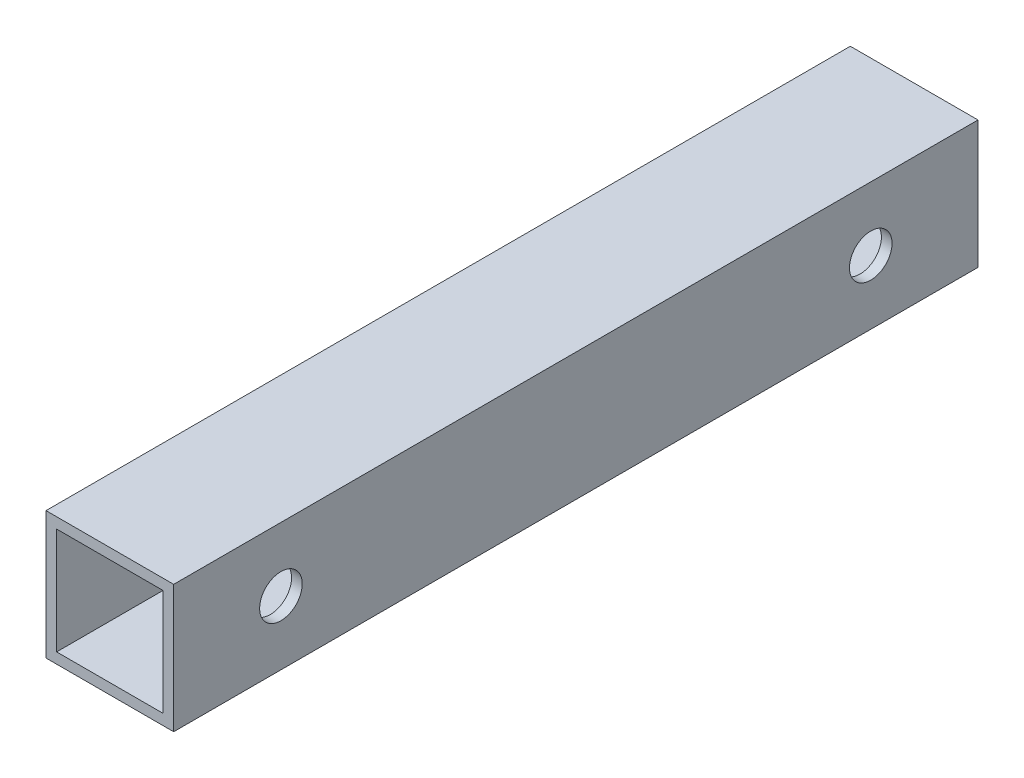
ISO-10303-21;
HEADER;
FILE_DESCRIPTION(('STEP AP214'),'2;1');
FILE_NAME('part.step','',(''),(''),'','','');
FILE_SCHEMA(('AUTOMOTIVE_DESIGN { 1 0 10303 214 1 1 1 1 }'));
ENDSEC;
DATA;
#1=APPLICATION_CONTEXT('core data for automotive mechanical design processes');
#2=APPLICATION_PROTOCOL_DEFINITION('international standard','automotive_design',2000,#1);
#3=PRODUCT_CONTEXT('',#1,'mechanical');
#4=PRODUCT('Part','Part','',(#3));
#5=PRODUCT_RELATED_PRODUCT_CATEGORY('part','',(#4));
#6=PRODUCT_DEFINITION_FORMATION('','',#4);
#7=PRODUCT_DEFINITION_CONTEXT('part definition',#1,'design');
#8=PRODUCT_DEFINITION('design','',#6,#7);
#9=PRODUCT_DEFINITION_SHAPE('','',#8);
#10=(LENGTH_UNIT() NAMED_UNIT(*) SI_UNIT(.MILLI.,.METRE.));
#11=(NAMED_UNIT(*) PLANE_ANGLE_UNIT() SI_UNIT($,.RADIAN.));
#12=(NAMED_UNIT(*) SI_UNIT($,.STERADIAN.) SOLID_ANGLE_UNIT());
#13=UNCERTAINTY_MEASURE_WITH_UNIT(LENGTH_MEASURE(1.E-05),#10,'distance_accuracy_value','');
#14=(GEOMETRIC_REPRESENTATION_CONTEXT(3) GLOBAL_UNCERTAINTY_ASSIGNED_CONTEXT((#13)) GLOBAL_UNIT_ASSIGNED_CONTEXT((#10,
#11,#12)) REPRESENTATION_CONTEXT('',''));
#15=CARTESIAN_POINT('',(0.,0.,0.));
#16=DIRECTION('',(0.,0.,1.));
#17=DIRECTION('',(1.,0.,0.));
#18=AXIS2_PLACEMENT_3D('',#15,#16,#17);
#19=CARTESIAN_POINT('',(0.,0.,15.));
#20=DIRECTION('',(0.,0.,-1.));
#21=DIRECTION('',(-1.,0.,0.));
#22=AXIS2_PLACEMENT_3D('',#19,#20,#21);
#23=PLANE('',#22);
#24=DIRECTION('',(0.,1.,0.));
#25=VECTOR('',#24,1.);
#26=CARTESIAN_POINT('',(2.38125,-2.38125000000001,15.));
#27=LINE('',#26,#25);
#28=CARTESIAN_POINT('',(2.38125,-2.38125000000001,15.));
#29=VERTEX_POINT('',#28);
#30=CARTESIAN_POINT('',(2.38125,2.38124999999999,15.));
#31=VERTEX_POINT('',#30);
#32=EDGE_CURVE('E137',#29,#31,#27,.T.);
#33=ORIENTED_EDGE('',*,*,#32,.T.);
#34=DIRECTION('',(-1.,0.,0.));
#35=VECTOR('',#34,1.);
#36=CARTESIAN_POINT('',(-2.38125,2.38124999999999,15.));
#37=LINE('',#36,#35);
#38=CARTESIAN_POINT('',(-2.38125,2.38124999999999,15.));
#39=VERTEX_POINT('',#38);
#40=EDGE_CURVE('E140',#31,#39,#37,.T.);
#41=ORIENTED_EDGE('',*,*,#40,.T.);
#42=DIRECTION('',(0.,-1.,0.));
#43=VECTOR('',#42,1.);
#44=CARTESIAN_POINT('',(-2.38125,-2.38125000000001,15.));
#45=LINE('',#44,#43);
#46=CARTESIAN_POINT('',(-2.38125,-2.38125000000001,15.));
#47=VERTEX_POINT('',#46);
#48=EDGE_CURVE('E143',#39,#47,#45,.T.);
#49=ORIENTED_EDGE('',*,*,#48,.T.);
#50=DIRECTION('',(1.,0.,0.));
#51=VECTOR('',#50,1.);
#52=CARTESIAN_POINT('',(-2.38125,-2.38125000000001,15.));
#53=LINE('',#52,#51);
#54=EDGE_CURVE('E145',#47,#29,#53,.T.);
#55=ORIENTED_EDGE('',*,*,#54,.T.);
#56=EDGE_LOOP('',(#33,#41,#49,#55));
#57=FACE_BOUND('',#56,.T.);
#58=DIRECTION('',(0.,1.,0.));
#59=VECTOR('',#58,1.);
#60=CARTESIAN_POINT('',(1.984375,-1.98437500000001,15.));
#61=LINE('',#60,#59);
#62=CARTESIAN_POINT('',(1.984375,-1.98437500000001,15.));
#63=VERTEX_POINT('',#62);
#64=CARTESIAN_POINT('',(1.984375,1.98437499999999,15.));
#65=VERTEX_POINT('',#64);
#66=EDGE_CURVE('E99',#63,#65,#61,.T.);
#67=ORIENTED_EDGE('',*,*,#66,.F.);
#68=DIRECTION('',(1.,0.,0.));
#69=VECTOR('',#68,1.);
#70=CARTESIAN_POINT('',(-1.984375,-1.98437500000001,15.));
#71=LINE('',#70,#69);
#72=CARTESIAN_POINT('',(-1.984375,-1.98437500000001,15.));
#73=VERTEX_POINT('',#72);
#74=EDGE_CURVE('E121',#73,#63,#71,.T.);
#75=ORIENTED_EDGE('',*,*,#74,.F.);
#76=DIRECTION('',(0.,-1.,0.));
#77=VECTOR('',#76,1.);
#78=CARTESIAN_POINT('',(-1.984375,-1.98437500000001,15.));
#79=LINE('',#78,#77);
#80=CARTESIAN_POINT('',(-1.984375,1.98437499999999,15.));
#81=VERTEX_POINT('',#80);
#82=EDGE_CURVE('E119',#81,#73,#79,.T.);
#83=ORIENTED_EDGE('',*,*,#82,.F.);
#84=DIRECTION('',(-1.,0.,0.));
#85=VECTOR('',#84,1.);
#86=CARTESIAN_POINT('',(-1.984375,1.98437499999999,15.));
#87=LINE('',#86,#85);
#88=EDGE_CURVE('E107',#65,#81,#87,.T.);
#89=ORIENTED_EDGE('',*,*,#88,.F.);
#90=EDGE_LOOP('',(#67,#75,#83,#89));
#91=FACE_BOUND('',#90,.T.);
#92=ADVANCED_FACE('F32',(#57,#91),#23,.F.);
#93=CARTESIAN_POINT('',(0.,0.,-15.));
#94=DIRECTION('',(0.,0.,-1.));
#95=DIRECTION('',(-1.,0.,0.));
#96=AXIS2_PLACEMENT_3D('',#93,#94,#95);
#97=PLANE('',#96);
#98=DIRECTION('',(0.,1.,0.));
#99=VECTOR('',#98,1.);
#100=CARTESIAN_POINT('',(2.38125,-2.38125000000001,-15.));
#101=LINE('',#100,#99);
#102=CARTESIAN_POINT('',(2.38125,-2.38125000000001,-15.));
#103=VERTEX_POINT('',#102);
#104=CARTESIAN_POINT('',(2.38125,2.38124999999999,-15.));
#105=VERTEX_POINT('',#104);
#106=EDGE_CURVE('E115',#103,#105,#101,.T.);
#107=ORIENTED_EDGE('',*,*,#106,.F.);
#108=DIRECTION('',(1.,0.,0.));
#109=VECTOR('',#108,1.);
#110=CARTESIAN_POINT('',(-2.38125,-2.38125000000001,-15.));
#111=LINE('',#110,#109);
#112=CARTESIAN_POINT('',(-2.38125,-2.38125000000001,-15.));
#113=VERTEX_POINT('',#112);
#114=EDGE_CURVE('E141',#113,#103,#111,.T.);
#115=ORIENTED_EDGE('',*,*,#114,.F.);
#116=DIRECTION('',(0.,-1.,0.));
#117=VECTOR('',#116,1.);
#118=CARTESIAN_POINT('',(-2.38125,-2.38125000000001,-15.));
#119=LINE('',#118,#117);
#120=CARTESIAN_POINT('',(-2.38125,2.38124999999999,-15.));
#121=VERTEX_POINT('',#120);
#122=EDGE_CURVE('E152',#121,#113,#119,.T.);
#123=ORIENTED_EDGE('',*,*,#122,.F.);
#124=DIRECTION('',(-1.,0.,0.));
#125=VECTOR('',#124,1.);
#126=CARTESIAN_POINT('',(-2.38125,2.38124999999999,-15.));
#127=LINE('',#126,#125);
#128=EDGE_CURVE('E150',#105,#121,#127,.T.);
#129=ORIENTED_EDGE('',*,*,#128,.F.);
#130=EDGE_LOOP('',(#107,#115,#123,#129));
#131=FACE_BOUND('',#130,.T.);
#132=DIRECTION('',(1.,0.,0.));
#133=VECTOR('',#132,1.);
#134=CARTESIAN_POINT('',(-1.984375,-1.98437500000001,-15.));
#135=LINE('',#134,#133);
#136=CARTESIAN_POINT('',(-1.984375,-1.98437500000001,-15.));
#137=VERTEX_POINT('',#136);
#138=CARTESIAN_POINT('',(1.984375,-1.98437500000001,-15.));
#139=VERTEX_POINT('',#138);
#140=EDGE_CURVE('E108',#137,#139,#135,.T.);
#141=ORIENTED_EDGE('',*,*,#140,.T.);
#142=DIRECTION('',(0.,1.,0.));
#143=VECTOR('',#142,1.);
#144=CARTESIAN_POINT('',(1.984375,-1.98437500000001,-15.));
#145=LINE('',#144,#143);
#146=CARTESIAN_POINT('',(1.984375,1.98437499999999,-15.));
#147=VERTEX_POINT('',#146);
#148=EDGE_CURVE('E57',#139,#147,#145,.T.);
#149=ORIENTED_EDGE('',*,*,#148,.T.);
#150=DIRECTION('',(-1.,0.,0.));
#151=VECTOR('',#150,1.);
#152=CARTESIAN_POINT('',(-1.984375,1.98437499999999,-15.));
#153=LINE('',#152,#151);
#154=CARTESIAN_POINT('',(-1.984375,1.98437499999999,-15.));
#155=VERTEX_POINT('',#154);
#156=EDGE_CURVE('E114',#147,#155,#153,.T.);
#157=ORIENTED_EDGE('',*,*,#156,.T.);
#158=DIRECTION('',(0.,-1.,0.));
#159=VECTOR('',#158,1.);
#160=CARTESIAN_POINT('',(-1.984375,-1.98437500000001,-15.));
#161=LINE('',#160,#159);
#162=EDGE_CURVE('E129',#155,#137,#161,.T.);
#163=ORIENTED_EDGE('',*,*,#162,.T.);
#164=EDGE_LOOP('',(#141,#149,#157,#163));
#165=FACE_BOUND('',#164,.T.);
#166=ADVANCED_FACE('F199',(#131,#165),#97,.T.);
#167=CARTESIAN_POINT('',(2.38125,-2.38125000000001,15.));
#168=DIRECTION('',(-1.,0.,0.));
#169=DIRECTION('',(0.,0.,1.));
#170=AXIS2_PLACEMENT_3D('',#167,#168,#169);
#171=PLANE('',#170);
#172=CARTESIAN_POINT('',(2.38125,0.,11.));
#173=DIRECTION('',(-1.,0.,0.));
#174=DIRECTION('',(0.,0.,1.));
#175=AXIS2_PLACEMENT_3D('',#172,#173,#174);
#176=CIRCLE('',#175,0.793749999999999);
#177=CARTESIAN_POINT('',(2.38125,0.,11.79375));
#178=VERTEX_POINT('',#177);
#179=EDGE_CURVE('E181',#178,#178,#176,.T.);
#180=ORIENTED_EDGE('',*,*,#179,.T.);
#181=EDGE_LOOP('',(#180));
#182=FACE_BOUND('',#181,.T.);
#183=CARTESIAN_POINT('',(2.38125,0.,-11.));
#184=DIRECTION('',(-1.,0.,0.));
#185=DIRECTION('',(0.,0.,1.));
#186=AXIS2_PLACEMENT_3D('',#183,#184,#185);
#187=CIRCLE('',#186,0.793749999999999);
#188=CARTESIAN_POINT('',(2.38125,0.,-10.20625));
#189=VERTEX_POINT('',#188);
#190=EDGE_CURVE('E163',#189,#189,#187,.T.);
#191=ORIENTED_EDGE('',*,*,#190,.T.);
#192=EDGE_LOOP('',(#191));
#193=FACE_BOUND('',#192,.T.);
#194=ORIENTED_EDGE('',*,*,#106,.T.);
#195=DIRECTION('',(0.,0.,-1.));
#196=VECTOR('',#195,1.);
#197=CARTESIAN_POINT('',(2.38125,2.38124999999999,15.));
#198=LINE('',#197,#196);
#199=EDGE_CURVE('E11',#31,#105,#198,.T.);
#200=ORIENTED_EDGE('',*,*,#199,.F.);
#201=ORIENTED_EDGE('',*,*,#32,.F.);
#202=DIRECTION('',(0.,0.,-1.));
#203=VECTOR('',#202,1.);
#204=CARTESIAN_POINT('',(2.38125,-2.38125000000001,15.));
#205=LINE('',#204,#203);
#206=EDGE_CURVE('E147',#29,#103,#205,.T.);
#207=ORIENTED_EDGE('',*,*,#206,.T.);
#208=EDGE_LOOP('',(#194,#200,#201,#207));
#209=FACE_BOUND('',#208,.T.);
#210=ADVANCED_FACE('F34',(#182,#193,#209),#171,.F.);
#211=CARTESIAN_POINT('',(-2.38125,2.38124999999999,15.));
#212=DIRECTION('',(0.,-1.,0.));
#213=DIRECTION('',(0.,0.,-1.));
#214=AXIS2_PLACEMENT_3D('',#211,#212,#213);
#215=PLANE('',#214);
#216=ORIENTED_EDGE('',*,*,#128,.T.);
#217=DIRECTION('',(0.,0.,-1.));
#218=VECTOR('',#217,1.);
#219=CARTESIAN_POINT('',(-2.38125,2.38124999999999,15.));
#220=LINE('',#219,#218);
#221=EDGE_CURVE('E41',#39,#121,#220,.T.);
#222=ORIENTED_EDGE('',*,*,#221,.F.);
#223=ORIENTED_EDGE('',*,*,#40,.F.);
#224=ORIENTED_EDGE('',*,*,#199,.T.);
#225=EDGE_LOOP('',(#216,#222,#223,#224));
#226=FACE_BOUND('',#225,.T.);
#227=ADVANCED_FACE('F225',(#226),#215,.F.);
#228=CARTESIAN_POINT('',(-2.38125,-2.38125000000001,15.));
#229=DIRECTION('',(1.,0.,0.));
#230=DIRECTION('',(0.,0.,-1.));
#231=AXIS2_PLACEMENT_3D('',#228,#229,#230);
#232=PLANE('',#231);
#233=CARTESIAN_POINT('',(-2.38125,0.,11.));
#234=DIRECTION('',(-1.,0.,0.));
#235=DIRECTION('',(0.,0.,1.));
#236=AXIS2_PLACEMENT_3D('',#233,#234,#235);
#237=CIRCLE('',#236,0.793749999999999);
#238=CARTESIAN_POINT('',(-2.38125,0.,11.79375));
#239=VERTEX_POINT('',#238);
#240=EDGE_CURVE('E178',#239,#239,#237,.T.);
#241=ORIENTED_EDGE('',*,*,#240,.F.);
#242=EDGE_LOOP('',(#241));
#243=FACE_BOUND('',#242,.T.);
#244=CARTESIAN_POINT('',(-2.38125,0.,-11.));
#245=DIRECTION('',(-1.,0.,0.));
#246=DIRECTION('',(0.,0.,1.));
#247=AXIS2_PLACEMENT_3D('',#244,#245,#246);
#248=CIRCLE('',#247,0.793749999999999);
#249=CARTESIAN_POINT('',(-2.38125,0.,-10.20625));
#250=VERTEX_POINT('',#249);
#251=EDGE_CURVE('E168',#250,#250,#248,.T.);
#252=ORIENTED_EDGE('',*,*,#251,.F.);
#253=EDGE_LOOP('',(#252));
#254=FACE_BOUND('',#253,.T.);
#255=ORIENTED_EDGE('',*,*,#122,.T.);
#256=DIRECTION('',(0.,0.,-1.));
#257=VECTOR('',#256,1.);
#258=CARTESIAN_POINT('',(-2.38125,-2.38125000000001,15.));
#259=LINE('',#258,#257);
#260=EDGE_CURVE('E157',#47,#113,#259,.T.);
#261=ORIENTED_EDGE('',*,*,#260,.F.);
#262=ORIENTED_EDGE('',*,*,#48,.F.);
#263=ORIENTED_EDGE('',*,*,#221,.T.);
#264=EDGE_LOOP('',(#255,#261,#262,#263));
#265=FACE_BOUND('',#264,.T.);
#266=ADVANCED_FACE('F222',(#243,#254,#265),#232,.F.);
#267=CARTESIAN_POINT('',(-2.38125,-2.38125000000001,15.));
#268=DIRECTION('',(0.,1.,0.));
#269=DIRECTION('',(0.,0.,1.));
#270=AXIS2_PLACEMENT_3D('',#267,#268,#269);
#271=PLANE('',#270);
#272=ORIENTED_EDGE('',*,*,#114,.T.);
#273=ORIENTED_EDGE('',*,*,#206,.F.);
#274=ORIENTED_EDGE('',*,*,#54,.F.);
#275=ORIENTED_EDGE('',*,*,#260,.T.);
#276=EDGE_LOOP('',(#272,#273,#274,#275));
#277=FACE_BOUND('',#276,.T.);
#278=ADVANCED_FACE('F219',(#277),#271,.F.);
#279=CARTESIAN_POINT('',(1.984375,-1.98437500000001,15.));
#280=DIRECTION('',(-1.,0.,0.));
#281=DIRECTION('',(0.,0.,1.));
#282=AXIS2_PLACEMENT_3D('',#279,#280,#281);
#283=PLANE('',#282);
#284=CARTESIAN_POINT('',(1.984375,0.,11.));
#285=DIRECTION('',(-1.,0.,0.));
#286=DIRECTION('',(0.,0.,1.));
#287=AXIS2_PLACEMENT_3D('',#284,#285,#286);
#288=CIRCLE('',#287,0.793749999999999);
#289=CARTESIAN_POINT('',(1.984375,0.,11.79375));
#290=VERTEX_POINT('',#289);
#291=EDGE_CURVE('E173',#290,#290,#288,.T.);
#292=ORIENTED_EDGE('',*,*,#291,.F.);
#293=EDGE_LOOP('',(#292));
#294=FACE_BOUND('',#293,.T.);
#295=CARTESIAN_POINT('',(1.984375,0.,-11.));
#296=DIRECTION('',(-1.,0.,0.));
#297=DIRECTION('',(0.,0.,1.));
#298=AXIS2_PLACEMENT_3D('',#295,#296,#297);
#299=CIRCLE('',#298,0.793749999999999);
#300=CARTESIAN_POINT('',(1.984375,0.,-10.20625));
#301=VERTEX_POINT('',#300);
#302=EDGE_CURVE('E127',#301,#301,#299,.T.);
#303=ORIENTED_EDGE('',*,*,#302,.F.);
#304=EDGE_LOOP('',(#303));
#305=FACE_BOUND('',#304,.T.);
#306=ORIENTED_EDGE('',*,*,#148,.F.);
#307=DIRECTION('',(0.,0.,-1.));
#308=VECTOR('',#307,1.);
#309=CARTESIAN_POINT('',(1.984375,-1.98437500000001,15.));
#310=LINE('',#309,#308);
#311=EDGE_CURVE('E103',#63,#139,#310,.T.);
#312=ORIENTED_EDGE('',*,*,#311,.F.);
#313=ORIENTED_EDGE('',*,*,#66,.T.);
#314=DIRECTION('',(0.,0.,-1.));
#315=VECTOR('',#314,1.);
#316=CARTESIAN_POINT('',(1.984375,1.98437499999999,15.));
#317=LINE('',#316,#315);
#318=EDGE_CURVE('E102',#65,#147,#317,.T.);
#319=ORIENTED_EDGE('',*,*,#318,.T.);
#320=EDGE_LOOP('',(#306,#312,#313,#319));
#321=FACE_BOUND('',#320,.T.);
#322=ADVANCED_FACE('F101',(#294,#305,#321),#283,.T.);
#323=CARTESIAN_POINT('',(-1.984375,1.98437499999999,15.));
#324=DIRECTION('',(0.,-1.,0.));
#325=DIRECTION('',(0.,0.,-1.));
#326=AXIS2_PLACEMENT_3D('',#323,#324,#325);
#327=PLANE('',#326);
#328=ORIENTED_EDGE('',*,*,#156,.F.);
#329=ORIENTED_EDGE('',*,*,#318,.F.);
#330=ORIENTED_EDGE('',*,*,#88,.T.);
#331=DIRECTION('',(0.,0.,-1.));
#332=VECTOR('',#331,1.);
#333=CARTESIAN_POINT('',(-1.984375,1.98437499999999,15.));
#334=LINE('',#333,#332);
#335=EDGE_CURVE('E116',#81,#155,#334,.T.);
#336=ORIENTED_EDGE('',*,*,#335,.T.);
#337=EDGE_LOOP('',(#328,#329,#330,#336));
#338=FACE_BOUND('',#337,.T.);
#339=ADVANCED_FACE('F111',(#338),#327,.T.);
#340=CARTESIAN_POINT('',(-1.984375,-1.98437500000001,15.));
#341=DIRECTION('',(1.,0.,0.));
#342=DIRECTION('',(0.,0.,-1.));
#343=AXIS2_PLACEMENT_3D('',#340,#341,#342);
#344=PLANE('',#343);
#345=CARTESIAN_POINT('',(-1.984375,0.,11.));
#346=DIRECTION('',(1.,0.,0.));
#347=DIRECTION('',(0.,0.,-1.));
#348=AXIS2_PLACEMENT_3D('',#345,#346,#347);
#349=CIRCLE('',#348,0.793749999999999);
#350=CARTESIAN_POINT('',(-1.984375,0.,11.79375));
#351=VERTEX_POINT('',#350);
#352=EDGE_CURVE('E36',#351,#351,#349,.T.);
#353=ORIENTED_EDGE('',*,*,#352,.F.);
#354=EDGE_LOOP('',(#353));
#355=FACE_BOUND('',#354,.T.);
#356=CARTESIAN_POINT('',(-1.984375,0.,-11.));
#357=DIRECTION('',(1.,0.,0.));
#358=DIRECTION('',(0.,0.,-1.));
#359=AXIS2_PLACEMENT_3D('',#356,#357,#358);
#360=CIRCLE('',#359,0.793749999999999);
#361=CARTESIAN_POINT('',(-1.984375,0.,-10.20625));
#362=VERTEX_POINT('',#361);
#363=EDGE_CURVE('E161',#362,#362,#360,.T.);
#364=ORIENTED_EDGE('',*,*,#363,.F.);
#365=EDGE_LOOP('',(#364));
#366=FACE_BOUND('',#365,.T.);
#367=ORIENTED_EDGE('',*,*,#162,.F.);
#368=ORIENTED_EDGE('',*,*,#335,.F.);
#369=ORIENTED_EDGE('',*,*,#82,.T.);
#370=DIRECTION('',(0.,0.,-1.));
#371=VECTOR('',#370,1.);
#372=CARTESIAN_POINT('',(-1.984375,-1.98437500000001,15.));
#373=LINE('',#372,#371);
#374=EDGE_CURVE('E49',#73,#137,#373,.T.);
#375=ORIENTED_EDGE('',*,*,#374,.T.);
#376=EDGE_LOOP('',(#367,#368,#369,#375));
#377=FACE_BOUND('',#376,.T.);
#378=ADVANCED_FACE('F191',(#355,#366,#377),#344,.T.);
#379=CARTESIAN_POINT('',(-1.984375,-1.98437500000001,15.));
#380=DIRECTION('',(0.,1.,0.));
#381=DIRECTION('',(0.,0.,1.));
#382=AXIS2_PLACEMENT_3D('',#379,#380,#381);
#383=PLANE('',#382);
#384=ORIENTED_EDGE('',*,*,#140,.F.);
#385=ORIENTED_EDGE('',*,*,#374,.F.);
#386=ORIENTED_EDGE('',*,*,#74,.T.);
#387=ORIENTED_EDGE('',*,*,#311,.T.);
#388=EDGE_LOOP('',(#384,#385,#386,#387));
#389=FACE_BOUND('',#388,.T.);
#390=ADVANCED_FACE('F194',(#389),#383,.T.);
#391=CARTESIAN_POINT('',(2.38125,0.,-11.));
#392=DIRECTION('',(-1.,0.,0.));
#393=DIRECTION('',(0.,0.,1.));
#394=AXIS2_PLACEMENT_3D('',#391,#392,#393);
#395=CYLINDRICAL_SURFACE('',#394,0.793749999999999);
#396=CARTESIAN_POINT('',(-1.984375,0.,-10.20625));
#397=CARTESIAN_POINT('',(-1.98850911458334,0.,-10.20625));
#398=CARTESIAN_POINT('',(-1.99264322916667,0.,-10.20625));
#399=CARTESIAN_POINT('',(-2.00091145833334,0.,-10.20625));
#400=CARTESIAN_POINT('',(-2.00504557291667,0.,-10.20625));
#401=CARTESIAN_POINT('',(-2.01331380208334,0.,-10.20625));
#402=CARTESIAN_POINT('',(-2.01744791666667,0.,-10.20625));
#403=CARTESIAN_POINT('',(-2.02571614583334,0.,-10.20625));
#404=CARTESIAN_POINT('',(-2.02985026041667,0.,-10.20625));
#405=CARTESIAN_POINT('',(-2.03811848958334,0.,-10.20625));
#406=CARTESIAN_POINT('',(-2.04225260416667,0.,-10.20625));
#407=CARTESIAN_POINT('',(-2.05052083333334,0.,-10.20625));
#408=CARTESIAN_POINT('',(-2.05465494791667,0.,-10.20625));
#409=CARTESIAN_POINT('',(-2.06292317708334,0.,-10.20625));
#410=CARTESIAN_POINT('',(-2.06705729166667,0.,-10.20625));
#411=CARTESIAN_POINT('',(-2.07532552083334,0.,-10.20625));
#412=CARTESIAN_POINT('',(-2.07945963541667,0.,-10.20625));
#413=CARTESIAN_POINT('',(-2.08772786458334,0.,-10.20625));
#414=CARTESIAN_POINT('',(-2.09186197916667,0.,-10.20625));
#415=CARTESIAN_POINT('',(-2.10013020833334,0.,-10.20625));
#416=CARTESIAN_POINT('',(-2.10426432291667,0.,-10.20625));
#417=CARTESIAN_POINT('',(-2.11253255208334,0.,-10.20625));
#418=CARTESIAN_POINT('',(-2.11666666666667,0.,-10.20625));
#419=CARTESIAN_POINT('',(-2.12493489583334,0.,-10.20625));
#420=CARTESIAN_POINT('',(-2.12906901041667,0.,-10.20625));
#421=CARTESIAN_POINT('',(-2.13733723958334,0.,-10.20625));
#422=CARTESIAN_POINT('',(-2.14147135416667,0.,-10.20625));
#423=CARTESIAN_POINT('',(-2.14973958333334,0.,-10.20625));
#424=CARTESIAN_POINT('',(-2.15387369791667,0.,-10.20625));
#425=CARTESIAN_POINT('',(-2.16214192708334,0.,-10.20625));
#426=CARTESIAN_POINT('',(-2.16627604166667,0.,-10.20625));
#427=CARTESIAN_POINT('',(-2.17454427083334,0.,-10.20625));
#428=CARTESIAN_POINT('',(-2.17867838541667,0.,-10.20625));
#429=CARTESIAN_POINT('',(-2.18694661458334,0.,-10.20625));
#430=CARTESIAN_POINT('',(-2.19108072916667,0.,-10.20625));
#431=CARTESIAN_POINT('',(-2.19934895833334,0.,-10.20625));
#432=CARTESIAN_POINT('',(-2.20348307291667,0.,-10.20625));
#433=CARTESIAN_POINT('',(-2.21175130208334,0.,-10.20625));
#434=CARTESIAN_POINT('',(-2.21588541666667,0.,-10.20625));
#435=CARTESIAN_POINT('',(-2.22415364583334,0.,-10.20625));
#436=CARTESIAN_POINT('',(-2.22828776041667,0.,-10.20625));
#437=CARTESIAN_POINT('',(-2.23655598958334,0.,-10.20625));
#438=CARTESIAN_POINT('',(-2.24069010416667,0.,-10.20625));
#439=CARTESIAN_POINT('',(-2.24895833333334,0.,-10.20625));
#440=CARTESIAN_POINT('',(-2.25309244791667,0.,-10.20625));
#441=CARTESIAN_POINT('',(-2.26136067708334,0.,-10.20625));
#442=CARTESIAN_POINT('',(-2.26549479166667,0.,-10.20625));
#443=CARTESIAN_POINT('',(-2.27376302083334,0.,-10.20625));
#444=CARTESIAN_POINT('',(-2.27789713541667,0.,-10.20625));
#445=CARTESIAN_POINT('',(-2.28616536458334,0.,-10.20625));
#446=CARTESIAN_POINT('',(-2.29029947916667,0.,-10.20625));
#447=CARTESIAN_POINT('',(-2.29856770833334,0.,-10.20625));
#448=CARTESIAN_POINT('',(-2.30270182291667,0.,-10.20625));
#449=CARTESIAN_POINT('',(-2.31097005208334,0.,-10.20625));
#450=CARTESIAN_POINT('',(-2.31510416666667,0.,-10.20625));
#451=CARTESIAN_POINT('',(-2.32337239583334,0.,-10.20625));
#452=CARTESIAN_POINT('',(-2.32750651041667,0.,-10.20625));
#453=CARTESIAN_POINT('',(-2.33577473958334,0.,-10.20625));
#454=CARTESIAN_POINT('',(-2.33990885416667,0.,-10.20625));
#455=CARTESIAN_POINT('',(-2.34817708333334,0.,-10.20625));
#456=CARTESIAN_POINT('',(-2.35231119791667,0.,-10.20625));
#457=CARTESIAN_POINT('',(-2.36057942708334,0.,-10.20625));
#458=CARTESIAN_POINT('',(-2.36471354166667,0.,-10.20625));
#459=CARTESIAN_POINT('',(-2.37298177083334,0.,-10.20625));
#460=CARTESIAN_POINT('',(-2.37711588541667,0.,-10.20625));
#461=CARTESIAN_POINT('',(-2.38125,0.,-10.20625));
#462=B_SPLINE_CURVE_WITH_KNOTS('',3,(#396,#397,#398,#399,#400,#401,#402,#403,#404,#405,#406,
#407,#408,#409,#410,#411,#412,#413,#414,#415,#416,#417,#418,#419,#420,#421,#422,#423,#424,#425,
#426,#427,#428,#429,#430,#431,#432,#433,#434,#435,#436,#437,#438,#439,#440,#441,#442,#443,#444,
#445,#446,#447,#448,#449,#450,#451,#452,#453,#454,#455,#456,#457,#458,#459,#460,#461),
.UNSPECIFIED.,.F.,.F.,(4,2,2,2,2,2,2,2,2,2,2,2,2,2,2,2,2,2,2,2,2,2,2,2,2,2,2,2,2,2,2,2,4),(0.,
0.0124023437499997,0.0248046875000003,0.03720703125,0.0496093749999997,0.0620117187500003,
0.0744140625,0.0868164062499998,0.0992187499999995,0.11162109375,0.1240234375,0.136425781249999,
0.148828125,0.16123046875,0.1736328125,0.18603515625,0.1984375,0.21083984375,0.2232421875,
0.23564453125,0.248046875,0.26044921875,0.2728515625,0.28525390625,0.29765625,0.31005859375,
0.3224609375,0.334863281249999,0.347265625,0.35966796875,0.372070312499999,0.38447265625,
0.396875),.UNSPECIFIED.);
#463=EDGE_CURVE('BSEAM201',#362,#250,#462,.T.);
#464=ORIENTED_EDGE('',*,*,#363,.T.);
#465=ORIENTED_EDGE('',*,*,#251,.T.);
#466=ORIENTED_EDGE('',*,*,#463,.T.);
#467=ORIENTED_EDGE('',*,*,#463,.F.);
#468=EDGE_LOOP('',(#464,#466,#465,#467));
#469=FACE_BOUND('',#468,.T.);
#470=ADVANCED_FACE('F201',(#469),#395,.F.);
#471=CARTESIAN_POINT('',(1.984375,0.,-10.20625));
#472=CARTESIAN_POINT('',(1.98850911458333,0.,-10.20625));
#473=CARTESIAN_POINT('',(1.99264322916666,0.,-10.20625));
#474=CARTESIAN_POINT('',(2.00091145833333,0.,-10.20625));
#475=CARTESIAN_POINT('',(2.00504557291666,0.,-10.20625));
#476=CARTESIAN_POINT('',(2.01331380208333,0.,-10.20625));
#477=CARTESIAN_POINT('',(2.01744791666667,0.,-10.20625));
#478=CARTESIAN_POINT('',(2.02571614583333,0.,-10.20625));
#479=CARTESIAN_POINT('',(2.02985026041666,0.,-10.20625));
#480=CARTESIAN_POINT('',(2.03811848958333,0.,-10.20625));
#481=CARTESIAN_POINT('',(2.04225260416666,0.,-10.20625));
#482=CARTESIAN_POINT('',(2.05052083333333,0.,-10.20625));
#483=CARTESIAN_POINT('',(2.05465494791666,0.,-10.20625));
#484=CARTESIAN_POINT('',(2.06292317708333,0.,-10.20625));
#485=CARTESIAN_POINT('',(2.06705729166666,0.,-10.20625));
#486=CARTESIAN_POINT('',(2.07532552083333,0.,-10.20625));
#487=CARTESIAN_POINT('',(2.07945963541666,0.,-10.20625));
#488=CARTESIAN_POINT('',(2.08772786458333,0.,-10.20625));
#489=CARTESIAN_POINT('',(2.09186197916666,0.,-10.20625));
#490=CARTESIAN_POINT('',(2.10013020833333,0.,-10.20625));
#491=CARTESIAN_POINT('',(2.10426432291666,0.,-10.20625));
#492=CARTESIAN_POINT('',(2.11253255208333,0.,-10.20625));
#493=CARTESIAN_POINT('',(2.11666666666666,0.,-10.20625));
#494=CARTESIAN_POINT('',(2.12493489583333,0.,-10.20625));
#495=CARTESIAN_POINT('',(2.12906901041666,0.,-10.20625));
#496=CARTESIAN_POINT('',(2.13733723958333,0.,-10.20625));
#497=CARTESIAN_POINT('',(2.14147135416666,0.,-10.20625));
#498=CARTESIAN_POINT('',(2.14973958333333,0.,-10.20625));
#499=CARTESIAN_POINT('',(2.15387369791666,0.,-10.20625));
#500=CARTESIAN_POINT('',(2.16214192708333,0.,-10.20625));
#501=CARTESIAN_POINT('',(2.16627604166666,0.,-10.20625));
#502=CARTESIAN_POINT('',(2.17454427083333,0.,-10.20625));
#503=CARTESIAN_POINT('',(2.17867838541666,0.,-10.20625));
#504=CARTESIAN_POINT('',(2.18694661458333,0.,-10.20625));
#505=CARTESIAN_POINT('',(2.19108072916666,0.,-10.20625));
#506=CARTESIAN_POINT('',(2.19934895833333,0.,-10.20625));
#507=CARTESIAN_POINT('',(2.20348307291667,0.,-10.20625));
#508=CARTESIAN_POINT('',(2.21175130208333,0.,-10.20625));
#509=CARTESIAN_POINT('',(2.21588541666666,0.,-10.20625));
#510=CARTESIAN_POINT('',(2.22415364583333,0.,-10.20625));
#511=CARTESIAN_POINT('',(2.22828776041666,0.,-10.20625));
#512=CARTESIAN_POINT('',(2.23655598958333,0.,-10.20625));
#513=CARTESIAN_POINT('',(2.24069010416666,0.,-10.20625));
#514=CARTESIAN_POINT('',(2.24895833333333,0.,-10.20625));
#515=CARTESIAN_POINT('',(2.25309244791666,0.,-10.20625));
#516=CARTESIAN_POINT('',(2.26136067708333,0.,-10.20625));
#517=CARTESIAN_POINT('',(2.26549479166667,0.,-10.20625));
#518=CARTESIAN_POINT('',(2.27376302083333,0.,-10.20625));
#519=CARTESIAN_POINT('',(2.27789713541666,0.,-10.20625));
#520=CARTESIAN_POINT('',(2.28616536458333,0.,-10.20625));
#521=CARTESIAN_POINT('',(2.29029947916666,0.,-10.20625));
#522=CARTESIAN_POINT('',(2.29856770833333,0.,-10.20625));
#523=CARTESIAN_POINT('',(2.30270182291666,0.,-10.20625));
#524=CARTESIAN_POINT('',(2.31097005208333,0.,-10.20625));
#525=CARTESIAN_POINT('',(2.31510416666667,0.,-10.20625));
#526=CARTESIAN_POINT('',(2.32337239583333,0.,-10.20625));
#527=CARTESIAN_POINT('',(2.32750651041666,0.,-10.20625));
#528=CARTESIAN_POINT('',(2.33577473958333,0.,-10.20625));
#529=CARTESIAN_POINT('',(2.33990885416666,0.,-10.20625));
#530=CARTESIAN_POINT('',(2.34817708333333,0.,-10.20625));
#531=CARTESIAN_POINT('',(2.35231119791667,0.,-10.20625));
#532=CARTESIAN_POINT('',(2.36057942708333,0.,-10.20625));
#533=CARTESIAN_POINT('',(2.36471354166666,0.,-10.20625));
#534=CARTESIAN_POINT('',(2.37298177083333,0.,-10.20625));
#535=CARTESIAN_POINT('',(2.37711588541666,0.,-10.20625));
#536=CARTESIAN_POINT('',(2.38125,0.,-10.20625));
#537=B_SPLINE_CURVE_WITH_KNOTS('',3,(#471,#472,#473,#474,#475,#476,#477,#478,#479,#480,#481,
#482,#483,#484,#485,#486,#487,#488,#489,#490,#491,#492,#493,#494,#495,#496,#497,#498,#499,#500,
#501,#502,#503,#504,#505,#506,#507,#508,#509,#510,#511,#512,#513,#514,#515,#516,#517,#518,#519,
#520,#521,#522,#523,#524,#525,#526,#527,#528,#529,#530,#531,#532,#533,#534,#535,#536),
.UNSPECIFIED.,.F.,.F.,(4,2,2,2,2,2,2,2,2,2,2,2,2,2,2,2,2,2,2,2,2,2,2,2,2,2,2,2,2,2,2,2,4),(0.,
0.0124023437500002,0.0248046875000003,0.03720703125,0.0496093750000002,0.0620117187500003,
0.0744140625,0.0868164062500002,0.0992187500000004,0.11162109375,0.1240234375,0.13642578125,
0.148828125,0.16123046875,0.1736328125,0.18603515625,0.1984375,0.21083984375,0.2232421875,
0.23564453125,0.248046875,0.26044921875,0.2728515625,0.28525390625,0.29765625,0.31005859375,
0.3224609375,0.33486328125,0.347265625,0.359667968750001,0.3720703125,0.38447265625,0.396875),.UNSPECIFIED.);
#538=EDGE_CURVE('BSEAM206',#301,#189,#537,.T.);
#539=ORIENTED_EDGE('',*,*,#302,.T.);
#540=ORIENTED_EDGE('',*,*,#190,.F.);
#541=ORIENTED_EDGE('',*,*,#538,.T.);
#542=ORIENTED_EDGE('',*,*,#538,.F.);
#543=EDGE_LOOP('',(#539,#541,#540,#542));
#544=FACE_BOUND('',#543,.T.);
#545=ADVANCED_FACE('F206',(#544),#395,.F.);
#546=CARTESIAN_POINT('',(2.38125,0.,11.));
#547=DIRECTION('',(-1.,0.,0.));
#548=DIRECTION('',(0.,0.,1.));
#549=AXIS2_PLACEMENT_3D('',#546,#547,#548);
#550=CYLINDRICAL_SURFACE('',#549,0.793749999999999);
#551=CARTESIAN_POINT('',(-1.984375,0.,11.79375));
#552=CARTESIAN_POINT('',(-1.98850911458334,0.,11.79375));
#553=CARTESIAN_POINT('',(-1.99264322916667,0.,11.79375));
#554=CARTESIAN_POINT('',(-2.00091145833334,0.,11.79375));
#555=CARTESIAN_POINT('',(-2.00504557291667,0.,11.79375));
#556=CARTESIAN_POINT('',(-2.01331380208334,0.,11.79375));
#557=CARTESIAN_POINT('',(-2.01744791666667,0.,11.79375));
#558=CARTESIAN_POINT('',(-2.02571614583334,0.,11.79375));
#559=CARTESIAN_POINT('',(-2.02985026041667,0.,11.79375));
#560=CARTESIAN_POINT('',(-2.03811848958334,0.,11.79375));
#561=CARTESIAN_POINT('',(-2.04225260416667,0.,11.79375));
#562=CARTESIAN_POINT('',(-2.05052083333334,0.,11.79375));
#563=CARTESIAN_POINT('',(-2.05465494791667,0.,11.79375));
#564=CARTESIAN_POINT('',(-2.06292317708334,0.,11.79375));
#565=CARTESIAN_POINT('',(-2.06705729166667,0.,11.79375));
#566=CARTESIAN_POINT('',(-2.07532552083334,0.,11.79375));
#567=CARTESIAN_POINT('',(-2.07945963541667,0.,11.79375));
#568=CARTESIAN_POINT('',(-2.08772786458334,0.,11.79375));
#569=CARTESIAN_POINT('',(-2.09186197916667,0.,11.79375));
#570=CARTESIAN_POINT('',(-2.10013020833334,0.,11.79375));
#571=CARTESIAN_POINT('',(-2.10426432291667,0.,11.79375));
#572=CARTESIAN_POINT('',(-2.11253255208334,0.,11.79375));
#573=CARTESIAN_POINT('',(-2.11666666666667,0.,11.79375));
#574=CARTESIAN_POINT('',(-2.12493489583334,0.,11.79375));
#575=CARTESIAN_POINT('',(-2.12906901041667,0.,11.79375));
#576=CARTESIAN_POINT('',(-2.13733723958334,0.,11.79375));
#577=CARTESIAN_POINT('',(-2.14147135416667,0.,11.79375));
#578=CARTESIAN_POINT('',(-2.14973958333334,0.,11.79375));
#579=CARTESIAN_POINT('',(-2.15387369791667,0.,11.79375));
#580=CARTESIAN_POINT('',(-2.16214192708334,0.,11.79375));
#581=CARTESIAN_POINT('',(-2.16627604166667,0.,11.79375));
#582=CARTESIAN_POINT('',(-2.17454427083334,0.,11.79375));
#583=CARTESIAN_POINT('',(-2.17867838541667,0.,11.79375));
#584=CARTESIAN_POINT('',(-2.18694661458334,0.,11.79375));
#585=CARTESIAN_POINT('',(-2.19108072916667,0.,11.79375));
#586=CARTESIAN_POINT('',(-2.19934895833334,0.,11.79375));
#587=CARTESIAN_POINT('',(-2.20348307291667,0.,11.79375));
#588=CARTESIAN_POINT('',(-2.21175130208334,0.,11.79375));
#589=CARTESIAN_POINT('',(-2.21588541666667,0.,11.79375));
#590=CARTESIAN_POINT('',(-2.22415364583334,0.,11.79375));
#591=CARTESIAN_POINT('',(-2.22828776041667,0.,11.79375));
#592=CARTESIAN_POINT('',(-2.23655598958334,0.,11.79375));
#593=CARTESIAN_POINT('',(-2.24069010416667,0.,11.79375));
#594=CARTESIAN_POINT('',(-2.24895833333334,0.,11.79375));
#595=CARTESIAN_POINT('',(-2.25309244791667,0.,11.79375));
#596=CARTESIAN_POINT('',(-2.26136067708334,0.,11.79375));
#597=CARTESIAN_POINT('',(-2.26549479166667,0.,11.79375));
#598=CARTESIAN_POINT('',(-2.27376302083334,0.,11.79375));
#599=CARTESIAN_POINT('',(-2.27789713541667,0.,11.79375));
#600=CARTESIAN_POINT('',(-2.28616536458334,0.,11.79375));
#601=CARTESIAN_POINT('',(-2.29029947916667,0.,11.79375));
#602=CARTESIAN_POINT('',(-2.29856770833334,0.,11.79375));
#603=CARTESIAN_POINT('',(-2.30270182291667,0.,11.79375));
#604=CARTESIAN_POINT('',(-2.31097005208334,0.,11.79375));
#605=CARTESIAN_POINT('',(-2.31510416666667,0.,11.79375));
#606=CARTESIAN_POINT('',(-2.32337239583334,0.,11.79375));
#607=CARTESIAN_POINT('',(-2.32750651041667,0.,11.79375));
#608=CARTESIAN_POINT('',(-2.33577473958334,0.,11.79375));
#609=CARTESIAN_POINT('',(-2.33990885416667,0.,11.79375));
#610=CARTESIAN_POINT('',(-2.34817708333334,0.,11.79375));
#611=CARTESIAN_POINT('',(-2.35231119791667,0.,11.79375));
#612=CARTESIAN_POINT('',(-2.36057942708334,0.,11.79375));
#613=CARTESIAN_POINT('',(-2.36471354166667,0.,11.79375));
#614=CARTESIAN_POINT('',(-2.37298177083334,0.,11.79375));
#615=CARTESIAN_POINT('',(-2.37711588541667,0.,11.79375));
#616=CARTESIAN_POINT('',(-2.38125,0.,11.79375));
#617=B_SPLINE_CURVE_WITH_KNOTS('',3,(#551,#552,#553,#554,#555,#556,#557,#558,#559,#560,#561,
#562,#563,#564,#565,#566,#567,#568,#569,#570,#571,#572,#573,#574,#575,#576,#577,#578,#579,#580,
#581,#582,#583,#584,#585,#586,#587,#588,#589,#590,#591,#592,#593,#594,#595,#596,#597,#598,#599,
#600,#601,#602,#603,#604,#605,#606,#607,#608,#609,#610,#611,#612,#613,#614,#615,#616),
.UNSPECIFIED.,.F.,.F.,(4,2,2,2,2,2,2,2,2,2,2,2,2,2,2,2,2,2,2,2,2,2,2,2,2,2,2,2,2,2,2,2,4),(0.,
0.0124023437499997,0.0248046875000003,0.03720703125,0.0496093749999997,0.0620117187500003,
0.0744140625,0.0868164062499998,0.0992187499999995,0.11162109375,0.1240234375,0.136425781249999,
0.148828125,0.16123046875,0.1736328125,0.18603515625,0.1984375,0.21083984375,0.2232421875,
0.23564453125,0.248046875,0.26044921875,0.2728515625,0.28525390625,0.29765625,0.31005859375,
0.3224609375,0.334863281249999,0.347265625,0.35966796875,0.372070312499999,0.38447265625,
0.396875),.UNSPECIFIED.);
#618=EDGE_CURVE('BSEAM188',#351,#239,#617,.T.);
#619=ORIENTED_EDGE('',*,*,#352,.T.);
#620=ORIENTED_EDGE('',*,*,#240,.T.);
#621=ORIENTED_EDGE('',*,*,#618,.T.);
#622=ORIENTED_EDGE('',*,*,#618,.F.);
#623=EDGE_LOOP('',(#619,#621,#620,#622));
#624=FACE_BOUND('',#623,.T.);
#625=ADVANCED_FACE('F188',(#624),#550,.F.);
#626=CARTESIAN_POINT('',(1.984375,0.,11.79375));
#627=CARTESIAN_POINT('',(1.98850911458333,0.,11.79375));
#628=CARTESIAN_POINT('',(1.99264322916666,0.,11.79375));
#629=CARTESIAN_POINT('',(2.00091145833333,0.,11.79375));
#630=CARTESIAN_POINT('',(2.00504557291666,0.,11.79375));
#631=CARTESIAN_POINT('',(2.01331380208333,0.,11.79375));
#632=CARTESIAN_POINT('',(2.01744791666667,0.,11.79375));
#633=CARTESIAN_POINT('',(2.02571614583333,0.,11.79375));
#634=CARTESIAN_POINT('',(2.02985026041666,0.,11.79375));
#635=CARTESIAN_POINT('',(2.03811848958333,0.,11.79375));
#636=CARTESIAN_POINT('',(2.04225260416666,0.,11.79375));
#637=CARTESIAN_POINT('',(2.05052083333333,0.,11.79375));
#638=CARTESIAN_POINT('',(2.05465494791666,0.,11.79375));
#639=CARTESIAN_POINT('',(2.06292317708333,0.,11.79375));
#640=CARTESIAN_POINT('',(2.06705729166666,0.,11.79375));
#641=CARTESIAN_POINT('',(2.07532552083333,0.,11.79375));
#642=CARTESIAN_POINT('',(2.07945963541666,0.,11.79375));
#643=CARTESIAN_POINT('',(2.08772786458333,0.,11.79375));
#644=CARTESIAN_POINT('',(2.09186197916666,0.,11.79375));
#645=CARTESIAN_POINT('',(2.10013020833333,0.,11.79375));
#646=CARTESIAN_POINT('',(2.10426432291666,0.,11.79375));
#647=CARTESIAN_POINT('',(2.11253255208333,0.,11.79375));
#648=CARTESIAN_POINT('',(2.11666666666666,0.,11.79375));
#649=CARTESIAN_POINT('',(2.12493489583333,0.,11.79375));
#650=CARTESIAN_POINT('',(2.12906901041666,0.,11.79375));
#651=CARTESIAN_POINT('',(2.13733723958333,0.,11.79375));
#652=CARTESIAN_POINT('',(2.14147135416666,0.,11.79375));
#653=CARTESIAN_POINT('',(2.14973958333333,0.,11.79375));
#654=CARTESIAN_POINT('',(2.15387369791666,0.,11.79375));
#655=CARTESIAN_POINT('',(2.16214192708333,0.,11.79375));
#656=CARTESIAN_POINT('',(2.16627604166666,0.,11.79375));
#657=CARTESIAN_POINT('',(2.17454427083333,0.,11.79375));
#658=CARTESIAN_POINT('',(2.17867838541666,0.,11.79375));
#659=CARTESIAN_POINT('',(2.18694661458333,0.,11.79375));
#660=CARTESIAN_POINT('',(2.19108072916666,0.,11.79375));
#661=CARTESIAN_POINT('',(2.19934895833333,0.,11.79375));
#662=CARTESIAN_POINT('',(2.20348307291667,0.,11.79375));
#663=CARTESIAN_POINT('',(2.21175130208333,0.,11.79375));
#664=CARTESIAN_POINT('',(2.21588541666666,0.,11.79375));
#665=CARTESIAN_POINT('',(2.22415364583333,0.,11.79375));
#666=CARTESIAN_POINT('',(2.22828776041666,0.,11.79375));
#667=CARTESIAN_POINT('',(2.23655598958333,0.,11.79375));
#668=CARTESIAN_POINT('',(2.24069010416666,0.,11.79375));
#669=CARTESIAN_POINT('',(2.24895833333333,0.,11.79375));
#670=CARTESIAN_POINT('',(2.25309244791666,0.,11.79375));
#671=CARTESIAN_POINT('',(2.26136067708333,0.,11.79375));
#672=CARTESIAN_POINT('',(2.26549479166667,0.,11.79375));
#673=CARTESIAN_POINT('',(2.27376302083333,0.,11.79375));
#674=CARTESIAN_POINT('',(2.27789713541666,0.,11.79375));
#675=CARTESIAN_POINT('',(2.28616536458333,0.,11.79375));
#676=CARTESIAN_POINT('',(2.29029947916666,0.,11.79375));
#677=CARTESIAN_POINT('',(2.29856770833333,0.,11.79375));
#678=CARTESIAN_POINT('',(2.30270182291666,0.,11.79375));
#679=CARTESIAN_POINT('',(2.31097005208333,0.,11.79375));
#680=CARTESIAN_POINT('',(2.31510416666667,0.,11.79375));
#681=CARTESIAN_POINT('',(2.32337239583333,0.,11.79375));
#682=CARTESIAN_POINT('',(2.32750651041666,0.,11.79375));
#683=CARTESIAN_POINT('',(2.33577473958333,0.,11.79375));
#684=CARTESIAN_POINT('',(2.33990885416666,0.,11.79375));
#685=CARTESIAN_POINT('',(2.34817708333333,0.,11.79375));
#686=CARTESIAN_POINT('',(2.35231119791667,0.,11.79375));
#687=CARTESIAN_POINT('',(2.36057942708333,0.,11.79375));
#688=CARTESIAN_POINT('',(2.36471354166666,0.,11.79375));
#689=CARTESIAN_POINT('',(2.37298177083333,0.,11.79375));
#690=CARTESIAN_POINT('',(2.37711588541666,0.,11.79375));
#691=CARTESIAN_POINT('',(2.38125,0.,11.79375));
#692=B_SPLINE_CURVE_WITH_KNOTS('',3,(#626,#627,#628,#629,#630,#631,#632,#633,#634,#635,#636,
#637,#638,#639,#640,#641,#642,#643,#644,#645,#646,#647,#648,#649,#650,#651,#652,#653,#654,#655,
#656,#657,#658,#659,#660,#661,#662,#663,#664,#665,#666,#667,#668,#669,#670,#671,#672,#673,#674,
#675,#676,#677,#678,#679,#680,#681,#682,#683,#684,#685,#686,#687,#688,#689,#690,#691),
.UNSPECIFIED.,.F.,.F.,(4,2,2,2,2,2,2,2,2,2,2,2,2,2,2,2,2,2,2,2,2,2,2,2,2,2,2,2,2,2,2,2,4),(0.,
0.0124023437500002,0.0248046875000003,0.03720703125,0.0496093750000002,0.0620117187500003,
0.0744140625,0.0868164062500002,0.0992187500000004,0.11162109375,0.1240234375,0.13642578125,
0.148828125,0.16123046875,0.1736328125,0.18603515625,0.1984375,0.21083984375,0.2232421875,
0.23564453125,0.248046875,0.26044921875,0.2728515625,0.28525390625,0.29765625,0.31005859375,
0.3224609375,0.33486328125,0.347265625,0.359667968750001,0.3720703125,0.38447265625,0.396875),.UNSPECIFIED.);
#693=EDGE_CURVE('BSEAM303',#290,#178,#692,.T.);
#694=ORIENTED_EDGE('',*,*,#291,.T.);
#695=ORIENTED_EDGE('',*,*,#179,.F.);
#696=ORIENTED_EDGE('',*,*,#693,.T.);
#697=ORIENTED_EDGE('',*,*,#693,.F.);
#698=EDGE_LOOP('',(#694,#696,#695,#697));
#699=FACE_BOUND('',#698,.T.);
#700=ADVANCED_FACE('F303',(#699),#550,.F.);
#701=CLOSED_SHELL('',(#92,#166,#210,#227,#266,#278,#322,#339,#378,#390,#470,#545,#625,#700));
#702=MANIFOLD_SOLID_BREP('B2',#701);
#703=ADVANCED_BREP_SHAPE_REPRESENTATION('',(#18,#702),#14);
#704=SHAPE_DEFINITION_REPRESENTATION(#9,#703);
ENDSEC;
END-ISO-10303-21;
